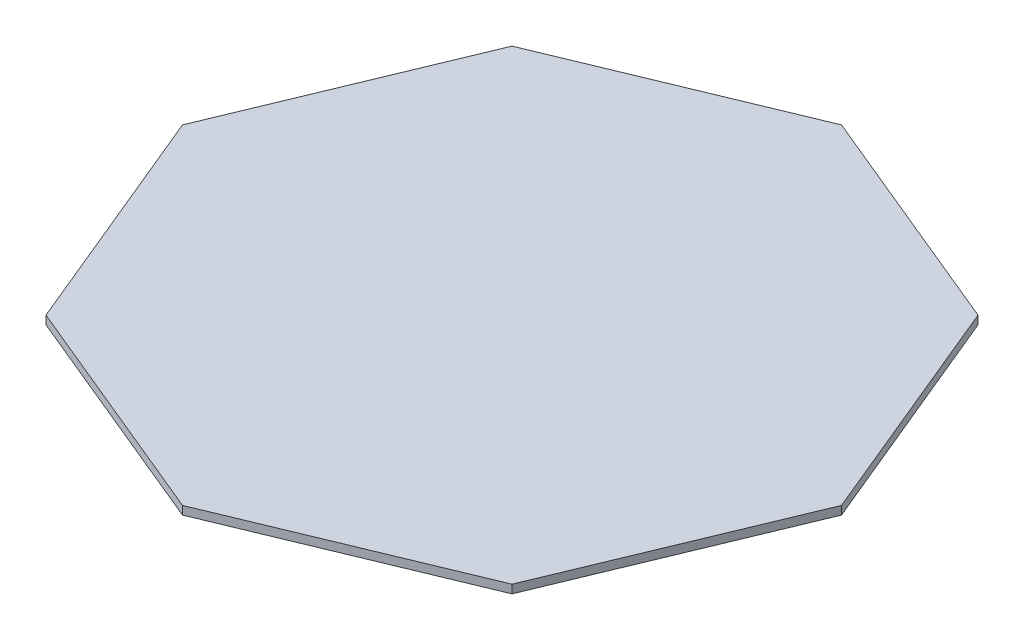
ISO-10303-21;
HEADER;
FILE_DESCRIPTION(('STEP AP214'),'2;1');
FILE_NAME('part.step','',(''),(''),'','','');
FILE_SCHEMA(('AUTOMOTIVE_DESIGN { 1 0 10303 214 1 1 1 1 }'));
ENDSEC;
DATA;
#1=APPLICATION_CONTEXT('core data for automotive mechanical design processes');
#2=APPLICATION_PROTOCOL_DEFINITION('international standard','automotive_design',2000,#1);
#3=PRODUCT_CONTEXT('',#1,'mechanical');
#4=PRODUCT('Part','Part','',(#3));
#5=PRODUCT_RELATED_PRODUCT_CATEGORY('part','',(#4));
#6=PRODUCT_DEFINITION_FORMATION('','',#4);
#7=PRODUCT_DEFINITION_CONTEXT('part definition',#1,'design');
#8=PRODUCT_DEFINITION('design','',#6,#7);
#9=PRODUCT_DEFINITION_SHAPE('','',#8);
#10=(LENGTH_UNIT() NAMED_UNIT(*) SI_UNIT(.MILLI.,.METRE.));
#11=(NAMED_UNIT(*) PLANE_ANGLE_UNIT() SI_UNIT($,.RADIAN.));
#12=(NAMED_UNIT(*) SI_UNIT($,.STERADIAN.) SOLID_ANGLE_UNIT());
#13=UNCERTAINTY_MEASURE_WITH_UNIT(LENGTH_MEASURE(1.E-05),#10,'distance_accuracy_value','');
#14=(GEOMETRIC_REPRESENTATION_CONTEXT(3) GLOBAL_UNCERTAINTY_ASSIGNED_CONTEXT((#13)) GLOBAL_UNIT_ASSIGNED_CONTEXT((#10,
#11,#12)) REPRESENTATION_CONTEXT('',''));
#15=CARTESIAN_POINT('',(0.,0.,0.));
#16=DIRECTION('',(0.,0.,1.));
#17=DIRECTION('',(1.,0.,0.));
#18=AXIS2_PLACEMENT_3D('',#15,#16,#17);
#19=CARTESIAN_POINT('',(55.4890976929386,2.,55.4890976929374));
#20=DIRECTION('',(-0.923879532511291,0.,-0.38268343236508));
#21=DIRECTION('',(-0.38268343236508,0.,0.923879532511291));
#22=AXIS2_PLACEMENT_3D('',#19,#20,#21);
#23=PLANE('',#22);
#24=DIRECTION('',(0.38268343236508,0.,-0.923879532511291));
#25=VECTOR('',#24,1.);
#26=CARTESIAN_POINT('',(55.4890976929386,0.,55.4890976929374));
#27=LINE('',#26,#25);
#28=CARTESIAN_POINT('',(55.4890976929386,0.,55.4890976929374));
#29=VERTEX_POINT('',#28);
#30=CARTESIAN_POINT('',(78.4734345211986,0.,-8.50014503228639E-13));
#31=VERTEX_POINT('',#30);
#32=EDGE_CURVE('E140',#29,#31,#27,.T.);
#33=ORIENTED_EDGE('',*,*,#32,.T.);
#34=DIRECTION('',(0.,-1.,0.));
#35=VECTOR('',#34,1.);
#36=CARTESIAN_POINT('',(78.4734345211986,2.,-8.50014503228639E-13));
#37=LINE('',#36,#35);
#38=CARTESIAN_POINT('',(78.4734345211986,2.,-8.50014503228639E-13));
#39=VERTEX_POINT('',#38);
#40=EDGE_CURVE('E11',#39,#31,#37,.T.);
#41=ORIENTED_EDGE('',*,*,#40,.F.);
#42=DIRECTION('',(0.38268343236508,0.,-0.923879532511291));
#43=VECTOR('',#42,1.);
#44=CARTESIAN_POINT('',(55.4890976929386,2.,55.4890976929374));
#45=LINE('',#44,#43);
#46=CARTESIAN_POINT('',(55.4890976929386,2.,55.4890976929374));
#47=VERTEX_POINT('',#46);
#48=EDGE_CURVE('E162',#47,#39,#45,.T.);
#49=ORIENTED_EDGE('',*,*,#48,.F.);
#50=DIRECTION('',(0.,-1.,0.));
#51=VECTOR('',#50,1.);
#52=CARTESIAN_POINT('',(55.4890976929386,2.,55.4890976929374));
#53=LINE('',#52,#51);
#54=EDGE_CURVE('E136',#47,#29,#53,.T.);
#55=ORIENTED_EDGE('',*,*,#54,.T.);
#56=EDGE_LOOP('',(#33,#41,#49,#55));
#57=FACE_BOUND('',#56,.T.);
#58=ADVANCED_FACE('F39',(#57),#23,.F.);
#59=CARTESIAN_POINT('',(78.4734345211986,2.,-8.50014503228639E-13));
#60=DIRECTION('',(-0.923879532511282,0.,0.3826834323651));
#61=DIRECTION('',(0.3826834323651,0.,0.923879532511283));
#62=AXIS2_PLACEMENT_3D('',#59,#60,#61);
#63=PLANE('',#62);
#64=DIRECTION('',(-0.3826834323651,0.,-0.923879532511282));
#65=VECTOR('',#64,1.);
#66=CARTESIAN_POINT('',(78.4734345211986,0.,-8.50014503228639E-13));
#67=LINE('',#66,#65);
#68=CARTESIAN_POINT('',(55.4890976929374,0.,-55.4890976929387));
#69=VERTEX_POINT('',#68);
#70=EDGE_CURVE('E144',#31,#69,#67,.T.);
#71=ORIENTED_EDGE('',*,*,#70,.T.);
#72=DIRECTION('',(0.,-1.,0.));
#73=VECTOR('',#72,1.);
#74=CARTESIAN_POINT('',(55.4890976929374,2.,-55.4890976929387));
#75=LINE('',#74,#73);
#76=CARTESIAN_POINT('',(55.4890976929374,2.,-55.4890976929387));
#77=VERTEX_POINT('',#76);
#78=EDGE_CURVE('E48',#77,#69,#75,.T.);
#79=ORIENTED_EDGE('',*,*,#78,.F.);
#80=DIRECTION('',(-0.3826834323651,0.,-0.923879532511282));
#81=VECTOR('',#80,1.);
#82=CARTESIAN_POINT('',(78.4734345211986,2.,-8.50014503228639E-13));
#83=LINE('',#82,#81);
#84=EDGE_CURVE('E99',#39,#77,#83,.T.);
#85=ORIENTED_EDGE('',*,*,#84,.F.);
#86=ORIENTED_EDGE('',*,*,#40,.T.);
#87=EDGE_LOOP('',(#71,#79,#85,#86));
#88=FACE_BOUND('',#87,.T.);
#89=ADVANCED_FACE('F208',(#88),#63,.F.);
#90=CARTESIAN_POINT('',(55.4890976929374,2.,-55.4890976929387));
#91=DIRECTION('',(-0.382683432365079,0.,0.923879532511291));
#92=DIRECTION('',(0.923879532511291,0.,0.382683432365079));
#93=AXIS2_PLACEMENT_3D('',#90,#91,#92);
#94=PLANE('',#93);
#95=DIRECTION('',(-0.923879532511291,0.,-0.382683432365079));
#96=VECTOR('',#95,1.);
#97=CARTESIAN_POINT('',(55.4890976929374,0.,-55.4890976929387));
#98=LINE('',#97,#96);
#99=CARTESIAN_POINT('',(-8.93382590128059E-13,0.,-78.4734345211986));
#100=VERTEX_POINT('',#99);
#101=EDGE_CURVE('E147',#69,#100,#98,.T.);
#102=ORIENTED_EDGE('',*,*,#101,.T.);
#103=DIRECTION('',(0.,-1.,0.));
#104=VECTOR('',#103,1.);
#105=CARTESIAN_POINT('',(-8.93382590128059E-13,2.,-78.4734345211986));
#106=LINE('',#105,#104);
#107=CARTESIAN_POINT('',(-8.93382590128059E-13,2.,-78.4734345211986));
#108=VERTEX_POINT('',#107);
#109=EDGE_CURVE('E173',#108,#100,#106,.T.);
#110=ORIENTED_EDGE('',*,*,#109,.F.);
#111=DIRECTION('',(-0.923879532511291,0.,-0.382683432365079));
#112=VECTOR('',#111,1.);
#113=CARTESIAN_POINT('',(55.4890976929374,2.,-55.4890976929387));
#114=LINE('',#113,#112);
#115=EDGE_CURVE('E183',#77,#108,#114,.T.);
#116=ORIENTED_EDGE('',*,*,#115,.F.);
#117=ORIENTED_EDGE('',*,*,#78,.T.);
#118=EDGE_LOOP('',(#102,#110,#116,#117));
#119=FACE_BOUND('',#118,.T.);
#120=ADVANCED_FACE('F181',(#119),#94,.F.);
#121=CARTESIAN_POINT('',(-8.93382590128059E-13,2.,-78.4734345211986));
#122=DIRECTION('',(0.382683432365101,0.,0.923879532511282));
#123=DIRECTION('',(0.923879532511282,0.,-0.382683432365101));
#124=AXIS2_PLACEMENT_3D('',#121,#122,#123);
#125=PLANE('',#124);
#126=DIRECTION('',(-0.923879532511282,0.,0.382683432365101));
#127=VECTOR('',#126,1.);
#128=CARTESIAN_POINT('',(-8.93382590128059E-13,0.,-78.4734345211986));
#129=LINE('',#128,#127);
#130=CARTESIAN_POINT('',(-55.4890976929386,0.,-55.4890976929374));
#131=VERTEX_POINT('',#130);
#132=EDGE_CURVE('E150',#100,#131,#129,.T.);
#133=ORIENTED_EDGE('',*,*,#132,.T.);
#134=DIRECTION('',(0.,-1.,0.));
#135=VECTOR('',#134,1.);
#136=CARTESIAN_POINT('',(-55.4890976929386,2.,-55.4890976929374));
#137=LINE('',#136,#135);
#138=CARTESIAN_POINT('',(-55.4890976929386,2.,-55.4890976929374));
#139=VERTEX_POINT('',#138);
#140=EDGE_CURVE('E169',#139,#131,#137,.T.);
#141=ORIENTED_EDGE('',*,*,#140,.F.);
#142=DIRECTION('',(-0.923879532511282,0.,0.382683432365101));
#143=VECTOR('',#142,1.);
#144=CARTESIAN_POINT('',(-8.93382590128059E-13,2.,-78.4734345211986));
#145=LINE('',#144,#143);
#146=EDGE_CURVE('E196',#108,#139,#145,.T.);
#147=ORIENTED_EDGE('',*,*,#146,.F.);
#148=ORIENTED_EDGE('',*,*,#109,.T.);
#149=EDGE_LOOP('',(#133,#141,#147,#148));
#150=FACE_BOUND('',#149,.T.);
#151=ADVANCED_FACE('F191',(#150),#125,.F.);
#152=CARTESIAN_POINT('',(-55.4890976929386,2.,-55.4890976929374));
#153=DIRECTION('',(0.923879532511291,0.,0.38268343236508));
#154=DIRECTION('',(0.38268343236508,0.,-0.923879532511291));
#155=AXIS2_PLACEMENT_3D('',#152,#153,#154);
#156=PLANE('',#155);
#157=DIRECTION('',(-0.38268343236508,0.,0.923879532511291));
#158=VECTOR('',#157,1.);
#159=CARTESIAN_POINT('',(-55.4890976929386,0.,-55.4890976929374));
#160=LINE('',#159,#158);
#161=CARTESIAN_POINT('',(-78.4734345211986,0.,8.50014503228639E-13));
#162=VERTEX_POINT('',#161);
#163=EDGE_CURVE('E153',#131,#162,#160,.T.);
#164=ORIENTED_EDGE('',*,*,#163,.T.);
#165=DIRECTION('',(0.,-1.,0.));
#166=VECTOR('',#165,1.);
#167=CARTESIAN_POINT('',(-78.4734345211986,2.,8.50014503228639E-13));
#168=LINE('',#167,#166);
#169=CARTESIAN_POINT('',(-78.4734345211986,2.,8.50014503228639E-13));
#170=VERTEX_POINT('',#169);
#171=EDGE_CURVE('E129',#170,#162,#168,.T.);
#172=ORIENTED_EDGE('',*,*,#171,.F.);
#173=DIRECTION('',(-0.38268343236508,0.,0.923879532511291));
#174=VECTOR('',#173,1.);
#175=CARTESIAN_POINT('',(-55.4890976929386,2.,-55.4890976929374));
#176=LINE('',#175,#174);
#177=EDGE_CURVE('E118',#139,#170,#176,.T.);
#178=ORIENTED_EDGE('',*,*,#177,.F.);
#179=ORIENTED_EDGE('',*,*,#140,.T.);
#180=EDGE_LOOP('',(#164,#172,#178,#179));
#181=FACE_BOUND('',#180,.T.);
#182=ADVANCED_FACE('F194',(#181),#156,.F.);
#183=CARTESIAN_POINT('',(-78.4734345211986,2.,8.50014503228639E-13));
#184=DIRECTION('',(0.923879532511283,0.,-0.3826834323651));
#185=DIRECTION('',(-0.3826834323651,0.,-0.923879532511283));
#186=AXIS2_PLACEMENT_3D('',#183,#184,#185);
#187=PLANE('',#186);
#188=DIRECTION('',(0.3826834323651,0.,0.923879532511283));
#189=VECTOR('',#188,1.);
#190=CARTESIAN_POINT('',(-78.4734345211986,0.,8.50014503228639E-13));
#191=LINE('',#190,#189);
#192=CARTESIAN_POINT('',(-55.4890976929374,0.,55.4890976929386));
#193=VERTEX_POINT('',#192);
#194=EDGE_CURVE('E127',#162,#193,#191,.T.);
#195=ORIENTED_EDGE('',*,*,#194,.T.);
#196=DIRECTION('',(0.,-1.,0.));
#197=VECTOR('',#196,1.);
#198=CARTESIAN_POINT('',(-55.4890976929374,2.,55.4890976929386));
#199=LINE('',#198,#197);
#200=CARTESIAN_POINT('',(-55.4890976929374,2.,55.4890976929386));
#201=VERTEX_POINT('',#200);
#202=EDGE_CURVE('E124',#201,#193,#199,.T.);
#203=ORIENTED_EDGE('',*,*,#202,.F.);
#204=DIRECTION('',(0.3826834323651,0.,0.923879532511283));
#205=VECTOR('',#204,1.);
#206=CARTESIAN_POINT('',(-78.4734345211986,2.,8.50014503228639E-13));
#207=LINE('',#206,#205);
#208=EDGE_CURVE('E112',#170,#201,#207,.T.);
#209=ORIENTED_EDGE('',*,*,#208,.F.);
#210=ORIENTED_EDGE('',*,*,#171,.T.);
#211=EDGE_LOOP('',(#195,#203,#209,#210));
#212=FACE_BOUND('',#211,.T.);
#213=ADVANCED_FACE('F125',(#212),#187,.F.);
#214=CARTESIAN_POINT('',(-55.4890976929374,2.,55.4890976929386));
#215=DIRECTION('',(0.38268343236508,0.,-0.923879532511291));
#216=DIRECTION('',(-0.923879532511291,0.,-0.38268343236508));
#217=AXIS2_PLACEMENT_3D('',#214,#215,#216);
#218=PLANE('',#217);
#219=DIRECTION('',(0.923879532511291,0.,0.38268343236508));
#220=VECTOR('',#219,1.);
#221=CARTESIAN_POINT('',(-55.4890976929374,0.,55.4890976929386));
#222=LINE('',#221,#220);
#223=CARTESIAN_POINT('',(8.4139813064607E-13,0.,78.4734345211986));
#224=VERTEX_POINT('',#223);
#225=EDGE_CURVE('E85',#193,#224,#222,.T.);
#226=ORIENTED_EDGE('',*,*,#225,.T.);
#227=DIRECTION('',(0.,-1.,0.));
#228=VECTOR('',#227,1.);
#229=CARTESIAN_POINT('',(8.4139813064607E-13,2.,78.4734345211986));
#230=LINE('',#229,#228);
#231=CARTESIAN_POINT('',(8.4139813064607E-13,2.,78.4734345211986));
#232=VERTEX_POINT('',#231);
#233=EDGE_CURVE('E130',#232,#224,#230,.T.);
#234=ORIENTED_EDGE('',*,*,#233,.F.);
#235=DIRECTION('',(0.923879532511291,0.,0.38268343236508));
#236=VECTOR('',#235,1.);
#237=CARTESIAN_POINT('',(-55.4890976929374,2.,55.4890976929386));
#238=LINE('',#237,#236);
#239=EDGE_CURVE('E116',#201,#232,#238,.T.);
#240=ORIENTED_EDGE('',*,*,#239,.F.);
#241=ORIENTED_EDGE('',*,*,#202,.T.);
#242=EDGE_LOOP('',(#226,#234,#240,#241));
#243=FACE_BOUND('',#242,.T.);
#244=ADVANCED_FACE('F132',(#243),#218,.F.);
#245=CARTESIAN_POINT('',(8.4139813064607E-13,2.,78.4734345211986));
#246=DIRECTION('',(-0.3826834323651,0.,-0.923879532511283));
#247=DIRECTION('',(-0.923879532511283,0.,0.3826834323651));
#248=AXIS2_PLACEMENT_3D('',#245,#246,#247);
#249=PLANE('',#248);
#250=DIRECTION('',(0.923879532511283,0.,-0.3826834323651));
#251=VECTOR('',#250,1.);
#252=CARTESIAN_POINT('',(8.4139813064607E-13,0.,78.4734345211986));
#253=LINE('',#252,#251);
#254=EDGE_CURVE('E91',#224,#29,#253,.T.);
#255=ORIENTED_EDGE('',*,*,#254,.T.);
#256=ORIENTED_EDGE('',*,*,#54,.F.);
#257=DIRECTION('',(0.923879532511283,0.,-0.3826834323651));
#258=VECTOR('',#257,1.);
#259=CARTESIAN_POINT('',(8.4139813064607E-13,2.,78.4734345211986));
#260=LINE('',#259,#258);
#261=EDGE_CURVE('E56',#232,#47,#260,.T.);
#262=ORIENTED_EDGE('',*,*,#261,.F.);
#263=ORIENTED_EDGE('',*,*,#233,.T.);
#264=EDGE_LOOP('',(#255,#256,#262,#263));
#265=FACE_BOUND('',#264,.T.);
#266=ADVANCED_FACE('F224',(#265),#249,.F.);
#267=CARTESIAN_POINT('',(0.,2.,0.));
#268=DIRECTION('',(0.,1.,0.));
#269=DIRECTION('',(0.,0.,1.));
#270=AXIS2_PLACEMENT_3D('',#267,#268,#269);
#271=PLANE('',#270);
#272=ORIENTED_EDGE('',*,*,#48,.T.);
#273=ORIENTED_EDGE('',*,*,#84,.T.);
#274=ORIENTED_EDGE('',*,*,#115,.T.);
#275=ORIENTED_EDGE('',*,*,#146,.T.);
#276=ORIENTED_EDGE('',*,*,#177,.T.);
#277=ORIENTED_EDGE('',*,*,#208,.T.);
#278=ORIENTED_EDGE('',*,*,#239,.T.);
#279=ORIENTED_EDGE('',*,*,#261,.T.);
#280=EDGE_LOOP('',(#272,#273,#274,#275,#276,#277,#278,#279));
#281=FACE_BOUND('',#280,.T.);
#282=ADVANCED_FACE('F114',(#281),#271,.T.);
#283=CARTESIAN_POINT('',(0.,0.,0.));
#284=DIRECTION('',(0.,1.,0.));
#285=DIRECTION('',(0.,0.,1.));
#286=AXIS2_PLACEMENT_3D('',#283,#284,#285);
#287=PLANE('',#286);
#288=ORIENTED_EDGE('',*,*,#32,.F.);
#289=ORIENTED_EDGE('',*,*,#254,.F.);
#290=ORIENTED_EDGE('',*,*,#225,.F.);
#291=ORIENTED_EDGE('',*,*,#194,.F.);
#292=ORIENTED_EDGE('',*,*,#163,.F.);
#293=ORIENTED_EDGE('',*,*,#132,.F.);
#294=ORIENTED_EDGE('',*,*,#101,.F.);
#295=ORIENTED_EDGE('',*,*,#70,.F.);
#296=EDGE_LOOP('',(#288,#289,#290,#291,#292,#293,#294,#295));
#297=FACE_BOUND('',#296,.T.);
#298=ADVANCED_FACE('F187',(#297),#287,.F.);
#299=CLOSED_SHELL('',(#58,#89,#120,#151,#182,#213,#244,#266,#282,#298));
#300=MANIFOLD_SOLID_BREP('B2',#299);
#301=ADVANCED_BREP_SHAPE_REPRESENTATION('',(#18,#300),#14);
#302=SHAPE_DEFINITION_REPRESENTATION(#9,#301);
ENDSEC;
END-ISO-10303-21;
